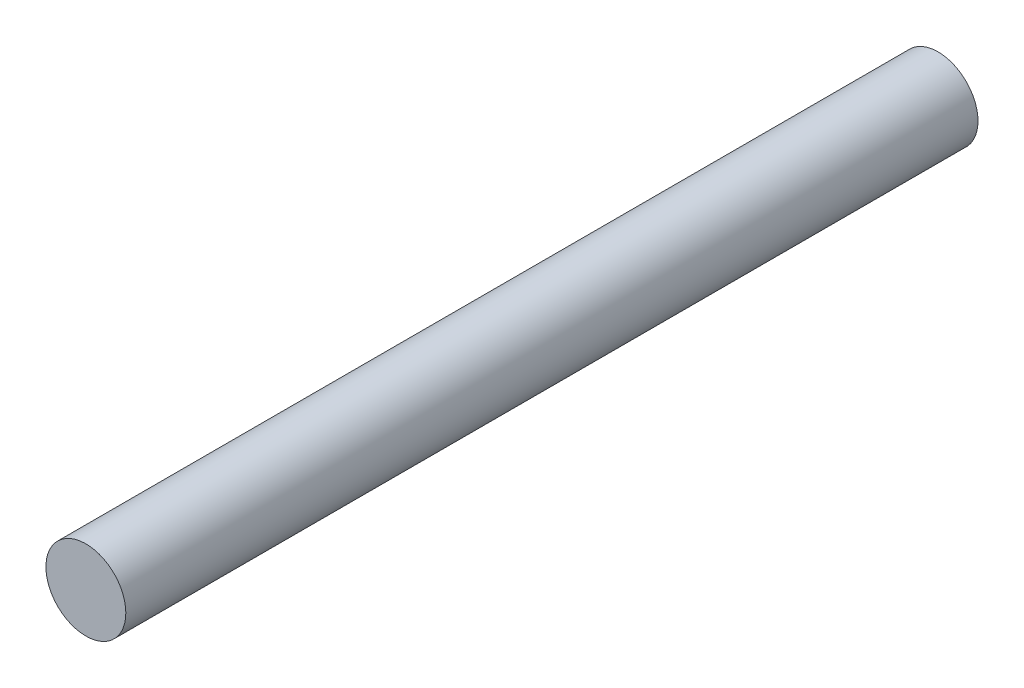
ISO-10303-21;
HEADER;
FILE_DESCRIPTION(('STEP AP214'),'2;1');
FILE_NAME('part.step','',(''),(''),'','','');
FILE_SCHEMA(('AUTOMOTIVE_DESIGN { 1 0 10303 214 1 1 1 1 }'));
ENDSEC;
DATA;
#1=APPLICATION_CONTEXT('core data for automotive mechanical design processes');
#2=APPLICATION_PROTOCOL_DEFINITION('international standard','automotive_design',2000,#1);
#3=PRODUCT_CONTEXT('',#1,'mechanical');
#4=PRODUCT('Part','Part','',(#3));
#5=PRODUCT_RELATED_PRODUCT_CATEGORY('part','',(#4));
#6=PRODUCT_DEFINITION_FORMATION('','',#4);
#7=PRODUCT_DEFINITION_CONTEXT('part definition',#1,'design');
#8=PRODUCT_DEFINITION('design','',#6,#7);
#9=PRODUCT_DEFINITION_SHAPE('','',#8);
#10=(LENGTH_UNIT() NAMED_UNIT(*) SI_UNIT(.MILLI.,.METRE.));
#11=(NAMED_UNIT(*) PLANE_ANGLE_UNIT() SI_UNIT($,.RADIAN.));
#12=(NAMED_UNIT(*) SI_UNIT($,.STERADIAN.) SOLID_ANGLE_UNIT());
#13=UNCERTAINTY_MEASURE_WITH_UNIT(LENGTH_MEASURE(1.E-05),#10,'distance_accuracy_value','');
#14=(GEOMETRIC_REPRESENTATION_CONTEXT(3) GLOBAL_UNCERTAINTY_ASSIGNED_CONTEXT((#13)) GLOBAL_UNIT_ASSIGNED_CONTEXT((#10,
#11,#12)) REPRESENTATION_CONTEXT('',''));
#15=CARTESIAN_POINT('',(0.,0.,0.));
#16=DIRECTION('',(0.,0.,1.));
#17=DIRECTION('',(1.,0.,0.));
#18=AXIS2_PLACEMENT_3D('',#15,#16,#17);
#19=CARTESIAN_POINT('',(0.,0.,32.));
#20=DIRECTION('',(0.,0.,-1.));
#21=DIRECTION('',(-1.,0.,0.));
#22=AXIS2_PLACEMENT_3D('',#19,#20,#21);
#23=CYLINDRICAL_SURFACE('',#22,1.5);
#24=CARTESIAN_POINT('',(0.,0.,32.));
#25=DIRECTION('',(0.,0.,1.));
#26=DIRECTION('',(1.,0.,0.));
#27=AXIS2_PLACEMENT_3D('',#24,#25,#26);
#28=CIRCLE('',#27,1.5);
#29=CARTESIAN_POINT('',(1.5,0.,32.));
#30=VERTEX_POINT('',#29);
#31=EDGE_CURVE('E10',#30,#30,#28,.T.);
#32=ORIENTED_EDGE('',*,*,#31,.F.);
#33=EDGE_LOOP('',(#32));
#34=FACE_BOUND('',#33,.T.);
#35=CARTESIAN_POINT('',(0.,0.,0.));
#36=DIRECTION('',(0.,0.,1.));
#37=DIRECTION('',(1.,0.,0.));
#38=AXIS2_PLACEMENT_3D('',#35,#36,#37);
#39=CIRCLE('',#38,1.5);
#40=CARTESIAN_POINT('',(1.5,0.,0.));
#41=VERTEX_POINT('',#40);
#42=EDGE_CURVE('E37',#41,#41,#39,.T.);
#43=ORIENTED_EDGE('',*,*,#42,.T.);
#44=EDGE_LOOP('',(#43));
#45=FACE_BOUND('',#44,.T.);
#46=ADVANCED_FACE('F31',(#34,#45),#23,.T.);
#47=CARTESIAN_POINT('',(0.,0.,32.));
#48=DIRECTION('',(0.,0.,1.));
#49=DIRECTION('',(1.,0.,0.));
#50=AXIS2_PLACEMENT_3D('',#47,#48,#49);
#51=PLANE('',#50);
#52=ORIENTED_EDGE('',*,*,#31,.T.);
#53=EDGE_LOOP('',(#52));
#54=FACE_BOUND('',#53,.T.);
#55=ADVANCED_FACE('F46',(#54),#51,.T.);
#56=CARTESIAN_POINT('',(0.,0.,0.));
#57=DIRECTION('',(0.,0.,1.));
#58=DIRECTION('',(1.,0.,0.));
#59=AXIS2_PLACEMENT_3D('',#56,#57,#58);
#60=PLANE('',#59);
#61=ORIENTED_EDGE('',*,*,#42,.F.);
#62=EDGE_LOOP('',(#61));
#63=FACE_BOUND('',#62,.T.);
#64=ADVANCED_FACE('F44',(#63),#60,.F.);
#65=CLOSED_SHELL('',(#46,#55,#64));
#66=MANIFOLD_SOLID_BREP('B2',#65);
#67=ADVANCED_BREP_SHAPE_REPRESENTATION('',(#18,#66),#14);
#68=SHAPE_DEFINITION_REPRESENTATION(#9,#67);
ENDSEC;
END-ISO-10303-21;
